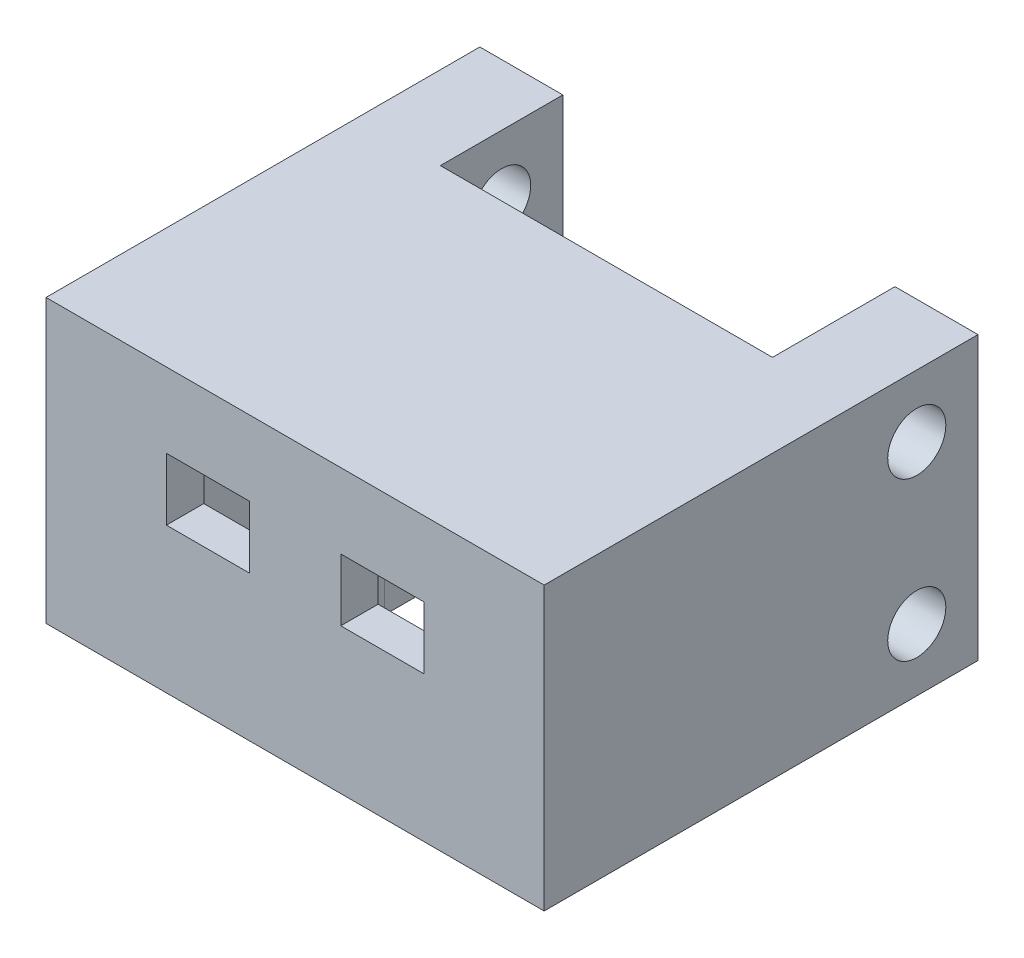
ISO-10303-21;
HEADER;
FILE_DESCRIPTION(('STEP AP214'),'2;1');
FILE_NAME('part.step','',(''),(''),'','','');
FILE_SCHEMA(('AUTOMOTIVE_DESIGN { 1 0 10303 214 1 1 1 1 }'));
ENDSEC;
DATA;
#1=APPLICATION_CONTEXT('core data for automotive mechanical design processes');
#2=APPLICATION_PROTOCOL_DEFINITION('international standard','automotive_design',2000,#1);
#3=PRODUCT_CONTEXT('',#1,'mechanical');
#4=PRODUCT('Part','Part','',(#3));
#5=PRODUCT_RELATED_PRODUCT_CATEGORY('part','',(#4));
#6=PRODUCT_DEFINITION_FORMATION('','',#4);
#7=PRODUCT_DEFINITION_CONTEXT('part definition',#1,'design');
#8=PRODUCT_DEFINITION('design','',#6,#7);
#9=PRODUCT_DEFINITION_SHAPE('','',#8);
#10=(LENGTH_UNIT() NAMED_UNIT(*) SI_UNIT(.MILLI.,.METRE.));
#11=(NAMED_UNIT(*) PLANE_ANGLE_UNIT() SI_UNIT($,.RADIAN.));
#12=(NAMED_UNIT(*) SI_UNIT($,.STERADIAN.) SOLID_ANGLE_UNIT());
#13=UNCERTAINTY_MEASURE_WITH_UNIT(LENGTH_MEASURE(1.E-05),#10,'distance_accuracy_value','');
#14=(GEOMETRIC_REPRESENTATION_CONTEXT(3) GLOBAL_UNCERTAINTY_ASSIGNED_CONTEXT((#13)) GLOBAL_UNIT_ASSIGNED_CONTEXT((#10,
#11,#12)) REPRESENTATION_CONTEXT('',''));
#15=CARTESIAN_POINT('',(0.,0.,0.));
#16=DIRECTION('',(0.,0.,1.));
#17=DIRECTION('',(1.,0.,0.));
#18=AXIS2_PLACEMENT_3D('',#15,#16,#17);
#19=CARTESIAN_POINT('',(0.,1.,0.));
#20=DIRECTION('',(0.,1.,0.));
#21=DIRECTION('',(0.,0.,1.));
#22=AXIS2_PLACEMENT_3D('',#19,#20,#21);
#23=PLANE('',#22);
#24=DIRECTION('',(1.,0.,0.));
#25=VECTOR('',#24,1.);
#26=CARTESIAN_POINT('',(0.,1.,3.35));
#27=LINE('',#26,#25);
#28=CARTESIAN_POINT('',(-3.3,1.,3.35));
#29=VERTEX_POINT('',#28);
#30=CARTESIAN_POINT('',(3.3,1.,3.35));
#31=VERTEX_POINT('',#30);
#32=EDGE_CURVE('E413',#29,#31,#27,.T.);
#33=ORIENTED_EDGE('',*,*,#32,.T.);
#34=DIRECTION('',(0.,0.,-1.));
#35=VECTOR('',#34,1.);
#36=CARTESIAN_POINT('',(3.3,1.,4.25));
#37=LINE('',#36,#35);
#38=CARTESIAN_POINT('',(3.3,1.,-3.25));
#39=VERTEX_POINT('',#38);
#40=EDGE_CURVE('E407',#31,#39,#37,.T.);
#41=ORIENTED_EDGE('',*,*,#40,.T.);
#42=DIRECTION('',(1.,0.,0.));
#43=VECTOR('',#42,1.);
#44=CARTESIAN_POINT('',(-4.,1.,-3.25));
#45=LINE('',#44,#43);
#46=CARTESIAN_POINT('',(2.1,1.,-3.25));
#47=VERTEX_POINT('',#46);
#48=EDGE_CURVE('E465',#47,#39,#45,.T.);
#49=ORIENTED_EDGE('',*,*,#48,.F.);
#50=DIRECTION('',(0.,0.,-1.));
#51=VECTOR('',#50,1.);
#52=CARTESIAN_POINT('',(2.1,1.,0.));
#53=LINE('',#52,#51);
#54=CARTESIAN_POINT('',(2.1,1.,0.));
#55=VERTEX_POINT('',#54);
#56=EDGE_CURVE('E436',#55,#47,#53,.T.);
#57=ORIENTED_EDGE('',*,*,#56,.F.);
#58=CARTESIAN_POINT('',(0.,1.,0.));
#59=DIRECTION('',(0.,1.,0.));
#60=DIRECTION('',(0.,0.,1.));
#61=AXIS2_PLACEMENT_3D('',#58,#59,#60);
#62=CIRCLE('',#61,2.1);
#63=CARTESIAN_POINT('',(-2.1,1.,0.));
#64=VERTEX_POINT('',#63);
#65=EDGE_CURVE('E456',#64,#55,#62,.T.);
#66=ORIENTED_EDGE('',*,*,#65,.F.);
#67=DIRECTION('',(0.,0.,-1.));
#68=VECTOR('',#67,1.);
#69=CARTESIAN_POINT('',(-2.1,1.,0.));
#70=LINE('',#69,#68);
#71=CARTESIAN_POINT('',(-2.1,1.,-3.25));
#72=VERTEX_POINT('',#71);
#73=EDGE_CURVE('E438',#64,#72,#70,.T.);
#74=ORIENTED_EDGE('',*,*,#73,.T.);
#75=CARTESIAN_POINT('',(-3.3,1.,-3.25));
#76=VERTEX_POINT('',#75);
#77=EDGE_CURVE('E462',#76,#72,#45,.T.);
#78=ORIENTED_EDGE('',*,*,#77,.F.);
#79=DIRECTION('',(0.,0.,1.));
#80=VECTOR('',#79,1.);
#81=CARTESIAN_POINT('',(-3.3,1.,-3.25));
#82=LINE('',#81,#80);
#83=EDGE_CURVE('E425',#76,#29,#82,.T.);
#84=ORIENTED_EDGE('',*,*,#83,.T.);
#85=EDGE_LOOP('',(#33,#41,#49,#57,#66,#74,#78,#84));
#86=FACE_BOUND('',#85,.T.);
#87=ADVANCED_FACE('F139',(#86),#23,.T.);
#88=CARTESIAN_POINT('',(0.,0.,0.));
#89=DIRECTION('',(0.,1.,0.));
#90=DIRECTION('',(0.,0.,1.));
#91=AXIS2_PLACEMENT_3D('',#88,#89,#90);
#92=PLANE('',#91);
#93=DIRECTION('',(0.,0.,-1.));
#94=VECTOR('',#93,1.);
#95=CARTESIAN_POINT('',(2.1,0.,0.));
#96=LINE('',#95,#94);
#97=CARTESIAN_POINT('',(2.1,0.,0.));
#98=VERTEX_POINT('',#97);
#99=CARTESIAN_POINT('',(2.1,0.,-3.25));
#100=VERTEX_POINT('',#99);
#101=EDGE_CURVE('E421',#98,#100,#96,.T.);
#102=ORIENTED_EDGE('',*,*,#101,.T.);
#103=DIRECTION('',(1.,0.,0.));
#104=VECTOR('',#103,1.);
#105=CARTESIAN_POINT('',(-4.,0.,-3.25));
#106=LINE('',#105,#104);
#107=CARTESIAN_POINT('',(4.,0.,-3.25));
#108=VERTEX_POINT('',#107);
#109=EDGE_CURVE('E467',#100,#108,#106,.T.);
#110=ORIENTED_EDGE('',*,*,#109,.T.);
#111=DIRECTION('',(0.,0.,1.));
#112=VECTOR('',#111,1.);
#113=CARTESIAN_POINT('',(4.,0.,-6.2));
#114=LINE('',#113,#112);
#115=CARTESIAN_POINT('',(4.,0.,-6.2));
#116=VERTEX_POINT('',#115);
#117=EDGE_CURVE('E402',#116,#108,#114,.T.);
#118=ORIENTED_EDGE('',*,*,#117,.F.);
#119=DIRECTION('',(1.,0.,0.));
#120=VECTOR('',#119,1.);
#121=CARTESIAN_POINT('',(4.,0.,-6.2));
#122=LINE('',#121,#120);
#123=CARTESIAN_POINT('',(6.,0.,-6.2));
#124=VERTEX_POINT('',#123);
#125=EDGE_CURVE('E397',#116,#124,#122,.T.);
#126=ORIENTED_EDGE('',*,*,#125,.T.);
#127=DIRECTION('',(0.,0.,1.));
#128=VECTOR('',#127,1.);
#129=CARTESIAN_POINT('',(6.,0.,-6.2));
#130=LINE('',#129,#128);
#131=CARTESIAN_POINT('',(6.,0.,4.25));
#132=VERTEX_POINT('',#131);
#133=EDGE_CURVE('E404',#124,#132,#130,.T.);
#134=ORIENTED_EDGE('',*,*,#133,.T.);
#135=DIRECTION('',(1.,0.,0.));
#136=VECTOR('',#135,1.);
#137=CARTESIAN_POINT('',(-4.,0.,4.25));
#138=LINE('',#137,#136);
#139=CARTESIAN_POINT('',(-6.,0.,4.25));
#140=VERTEX_POINT('',#139);
#141=EDGE_CURVE('E459',#140,#132,#138,.T.);
#142=ORIENTED_EDGE('',*,*,#141,.F.);
#143=DIRECTION('',(0.,0.,1.));
#144=VECTOR('',#143,1.);
#145=CARTESIAN_POINT('',(-6.,0.,-6.2));
#146=LINE('',#145,#144);
#147=CARTESIAN_POINT('',(-6.,0.,-6.2));
#148=VERTEX_POINT('',#147);
#149=EDGE_CURVE('E385',#148,#140,#146,.T.);
#150=ORIENTED_EDGE('',*,*,#149,.F.);
#151=DIRECTION('',(1.,0.,0.));
#152=VECTOR('',#151,1.);
#153=CARTESIAN_POINT('',(-4.,0.,-6.2));
#154=LINE('',#153,#152);
#155=CARTESIAN_POINT('',(-4.,0.,-6.2));
#156=VERTEX_POINT('',#155);
#157=EDGE_CURVE('E382',#148,#156,#154,.T.);
#158=ORIENTED_EDGE('',*,*,#157,.T.);
#159=DIRECTION('',(0.,0.,1.));
#160=VECTOR('',#159,1.);
#161=CARTESIAN_POINT('',(-4.,0.,-6.2));
#162=LINE('',#161,#160);
#163=CARTESIAN_POINT('',(-4.,0.,-3.25));
#164=VERTEX_POINT('',#163);
#165=EDGE_CURVE('E388',#156,#164,#162,.T.);
#166=ORIENTED_EDGE('',*,*,#165,.T.);
#167=CARTESIAN_POINT('',(-2.1,0.,-3.25));
#168=VERTEX_POINT('',#167);
#169=EDGE_CURVE('E468',#164,#168,#106,.T.);
#170=ORIENTED_EDGE('',*,*,#169,.T.);
#171=DIRECTION('',(0.,0.,-1.));
#172=VECTOR('',#171,1.);
#173=CARTESIAN_POINT('',(-2.1,0.,0.));
#174=LINE('',#173,#172);
#175=CARTESIAN_POINT('',(-2.1,0.,0.));
#176=VERTEX_POINT('',#175);
#177=EDGE_CURVE('E439',#176,#168,#174,.T.);
#178=ORIENTED_EDGE('',*,*,#177,.F.);
#179=CARTESIAN_POINT('',(0.,0.,0.));
#180=DIRECTION('',(0.,1.,0.));
#181=DIRECTION('',(0.,0.,1.));
#182=AXIS2_PLACEMENT_3D('',#179,#180,#181);
#183=CIRCLE('',#182,2.1);
#184=EDGE_CURVE('E455',#176,#98,#183,.T.);
#185=ORIENTED_EDGE('',*,*,#184,.T.);
#186=EDGE_LOOP('',(#102,#110,#118,#126,#134,#142,#150,#158,#166,#170,#178,#185));
#187=FACE_BOUND('',#186,.T.);
#188=ADVANCED_FACE('F539',(#187),#92,.F.);
#189=CARTESIAN_POINT('',(0.,1.,0.));
#190=DIRECTION('',(0.,-1.,0.));
#191=DIRECTION('',(0.,0.,-1.));
#192=AXIS2_PLACEMENT_3D('',#189,#190,#191);
#193=CYLINDRICAL_SURFACE('',#192,2.1);
#194=ORIENTED_EDGE('',*,*,#65,.T.);
#195=DIRECTION('',(0.,-1.,0.));
#196=VECTOR('',#195,1.);
#197=CARTESIAN_POINT('',(2.1,1.,0.));
#198=LINE('',#197,#196);
#199=EDGE_CURVE('E452',#55,#98,#198,.T.);
#200=ORIENTED_EDGE('',*,*,#199,.T.);
#201=ORIENTED_EDGE('',*,*,#184,.F.);
#202=DIRECTION('',(0.,-1.,0.));
#203=VECTOR('',#202,1.);
#204=CARTESIAN_POINT('',(-2.1,1.,0.));
#205=LINE('',#204,#203);
#206=EDGE_CURVE('E442',#64,#176,#205,.T.);
#207=ORIENTED_EDGE('',*,*,#206,.F.);
#208=EDGE_LOOP('',(#194,#200,#201,#207));
#209=FACE_BOUND('',#208,.T.);
#210=ADVANCED_FACE('F545',(#209),#193,.F.);
#211=CARTESIAN_POINT('',(-4.,1.,4.25));
#212=DIRECTION('',(0.,0.,-1.));
#213=DIRECTION('',(-1.,0.,0.));
#214=AXIS2_PLACEMENT_3D('',#211,#212,#213);
#215=PLANE('',#214);
#216=DIRECTION('',(1.,0.,0.));
#217=VECTOR('',#216,1.);
#218=CARTESIAN_POINT('',(-3.1,3.5,4.25));
#219=LINE('',#218,#217);
#220=CARTESIAN_POINT('',(-3.1,3.5,4.25));
#221=VERTEX_POINT('',#220);
#222=CARTESIAN_POINT('',(-1.1,3.5,4.25));
#223=VERTEX_POINT('',#222);
#224=EDGE_CURVE('E316',#221,#223,#219,.T.);
#225=ORIENTED_EDGE('',*,*,#224,.F.);
#226=DIRECTION('',(0.,-1.,0.));
#227=VECTOR('',#226,1.);
#228=CARTESIAN_POINT('',(-3.1,5.,4.25));
#229=LINE('',#228,#227);
#230=CARTESIAN_POINT('',(-3.1,5.,4.25));
#231=VERTEX_POINT('',#230);
#232=EDGE_CURVE('E154',#231,#221,#229,.T.);
#233=ORIENTED_EDGE('',*,*,#232,.F.);
#234=DIRECTION('',(-1.,0.,0.));
#235=VECTOR('',#234,1.);
#236=CARTESIAN_POINT('',(-3.1,5.,4.25));
#237=LINE('',#236,#235);
#238=CARTESIAN_POINT('',(-1.1,5.,4.25));
#239=VERTEX_POINT('',#238);
#240=EDGE_CURVE('E322',#239,#231,#237,.T.);
#241=ORIENTED_EDGE('',*,*,#240,.F.);
#242=DIRECTION('',(0.,1.,0.));
#243=VECTOR('',#242,1.);
#244=CARTESIAN_POINT('',(-1.1,5.,4.25));
#245=LINE('',#244,#243);
#246=EDGE_CURVE('E306',#223,#239,#245,.T.);
#247=ORIENTED_EDGE('',*,*,#246,.F.);
#248=EDGE_LOOP('',(#225,#233,#241,#247));
#249=FACE_BOUND('',#248,.T.);
#250=DIRECTION('',(1.,0.,0.));
#251=VECTOR('',#250,1.);
#252=CARTESIAN_POINT('',(1.1,3.5,4.25));
#253=LINE('',#252,#251);
#254=CARTESIAN_POINT('',(1.1,3.5,4.25));
#255=VERTEX_POINT('',#254);
#256=CARTESIAN_POINT('',(3.1,3.5,4.25));
#257=VERTEX_POINT('',#256);
#258=EDGE_CURVE('E333',#255,#257,#253,.T.);
#259=ORIENTED_EDGE('',*,*,#258,.F.);
#260=DIRECTION('',(0.,-1.,0.));
#261=VECTOR('',#260,1.);
#262=CARTESIAN_POINT('',(1.1,5.,4.25));
#263=LINE('',#262,#261);
#264=CARTESIAN_POINT('',(1.1,5.,4.25));
#265=VERTEX_POINT('',#264);
#266=EDGE_CURVE('E162',#265,#255,#263,.T.);
#267=ORIENTED_EDGE('',*,*,#266,.F.);
#268=DIRECTION('',(-1.,0.,0.));
#269=VECTOR('',#268,1.);
#270=CARTESIAN_POINT('',(1.1,5.,4.25));
#271=LINE('',#270,#269);
#272=CARTESIAN_POINT('',(3.1,5.,4.25));
#273=VERTEX_POINT('',#272);
#274=EDGE_CURVE('E340',#273,#265,#271,.T.);
#275=ORIENTED_EDGE('',*,*,#274,.F.);
#276=DIRECTION('',(0.,1.,0.));
#277=VECTOR('',#276,1.);
#278=CARTESIAN_POINT('',(3.1,5.,4.25));
#279=LINE('',#278,#277);
#280=EDGE_CURVE('E337',#257,#273,#279,.T.);
#281=ORIENTED_EDGE('',*,*,#280,.F.);
#282=EDGE_LOOP('',(#259,#267,#275,#281));
#283=FACE_BOUND('',#282,.T.);
#284=ORIENTED_EDGE('',*,*,#141,.T.);
#285=DIRECTION('',(0.,1.,0.));
#286=VECTOR('',#285,1.);
#287=CARTESIAN_POINT('',(6.,5.8,4.25));
#288=LINE('',#287,#286);
#289=CARTESIAN_POINT('',(6.,6.8,4.25));
#290=VERTEX_POINT('',#289);
#291=EDGE_CURVE('E391',#132,#290,#288,.T.);
#292=ORIENTED_EDGE('',*,*,#291,.T.);
#293=DIRECTION('',(1.,0.,0.));
#294=VECTOR('',#293,1.);
#295=CARTESIAN_POINT('',(0.,6.8,4.25));
#296=LINE('',#295,#294);
#297=CARTESIAN_POINT('',(-6.,6.8,4.25));
#298=VERTEX_POINT('',#297);
#299=EDGE_CURVE('E363',#298,#290,#296,.T.);
#300=ORIENTED_EDGE('',*,*,#299,.F.);
#301=DIRECTION('',(0.,-1.,0.));
#302=VECTOR('',#301,1.);
#303=CARTESIAN_POINT('',(-6.,5.8,4.25));
#304=LINE('',#303,#302);
#305=EDGE_CURVE('E375',#298,#140,#304,.T.);
#306=ORIENTED_EDGE('',*,*,#305,.T.);
#307=EDGE_LOOP('',(#284,#292,#300,#306));
#308=FACE_BOUND('',#307,.T.);
#309=ADVANCED_FACE('F141',(#249,#283,#308),#215,.F.);
#310=CARTESIAN_POINT('',(-4.,1.,-3.25));
#311=DIRECTION('',(0.,0.,-1.));
#312=DIRECTION('',(-1.,0.,0.));
#313=AXIS2_PLACEMENT_3D('',#310,#311,#312);
#314=PLANE('',#313);
#315=DIRECTION('',(0.,-1.,0.));
#316=VECTOR('',#315,1.);
#317=CARTESIAN_POINT('',(-2.1,1.,-3.25));
#318=LINE('',#317,#316);
#319=EDGE_CURVE('E447',#72,#168,#318,.T.);
#320=ORIENTED_EDGE('',*,*,#319,.T.);
#321=ORIENTED_EDGE('',*,*,#169,.F.);
#322=DIRECTION('',(0.,-1.,0.));
#323=VECTOR('',#322,1.);
#324=CARTESIAN_POINT('',(-4.,1.,-3.25));
#325=LINE('',#324,#323);
#326=CARTESIAN_POINT('',(-4.,6.8,-3.25));
#327=VERTEX_POINT('',#326);
#328=EDGE_CURVE('E464',#327,#164,#325,.T.);
#329=ORIENTED_EDGE('',*,*,#328,.F.);
#330=DIRECTION('',(1.,0.,0.));
#331=VECTOR('',#330,1.);
#332=CARTESIAN_POINT('',(0.,6.8,-3.25));
#333=LINE('',#332,#331);
#334=CARTESIAN_POINT('',(4.,6.8,-3.25));
#335=VERTEX_POINT('',#334);
#336=EDGE_CURVE('E351',#327,#335,#333,.T.);
#337=ORIENTED_EDGE('',*,*,#336,.T.);
#338=DIRECTION('',(0.,-1.,0.));
#339=VECTOR('',#338,1.);
#340=CARTESIAN_POINT('',(4.,1.,-3.25));
#341=LINE('',#340,#339);
#342=EDGE_CURVE('E473',#335,#108,#341,.T.);
#343=ORIENTED_EDGE('',*,*,#342,.T.);
#344=ORIENTED_EDGE('',*,*,#109,.F.);
#345=DIRECTION('',(0.,-1.,0.));
#346=VECTOR('',#345,1.);
#347=CARTESIAN_POINT('',(2.1,1.,-3.25));
#348=LINE('',#347,#346);
#349=EDGE_CURVE('E450',#47,#100,#348,.T.);
#350=ORIENTED_EDGE('',*,*,#349,.F.);
#351=ORIENTED_EDGE('',*,*,#48,.T.);
#352=DIRECTION('',(0.,-1.,0.));
#353=VECTOR('',#352,1.);
#354=CARTESIAN_POINT('',(3.3,5.8,-3.25));
#355=LINE('',#354,#353);
#356=CARTESIAN_POINT('',(3.3,5.8,-3.25));
#357=VERTEX_POINT('',#356);
#358=EDGE_CURVE('E428',#357,#39,#355,.T.);
#359=ORIENTED_EDGE('',*,*,#358,.F.);
#360=DIRECTION('',(1.,0.,0.));
#361=VECTOR('',#360,1.);
#362=CARTESIAN_POINT('',(0.,5.8,-3.25));
#363=LINE('',#362,#361);
#364=CARTESIAN_POINT('',(-3.3,5.8,-3.25));
#365=VERTEX_POINT('',#364);
#366=EDGE_CURVE('E329',#365,#357,#363,.T.);
#367=ORIENTED_EDGE('',*,*,#366,.F.);
#368=DIRECTION('',(0.,-1.,0.));
#369=VECTOR('',#368,1.);
#370=CARTESIAN_POINT('',(-3.3,5.8,-3.25));
#371=LINE('',#370,#369);
#372=EDGE_CURVE('E416',#365,#76,#371,.T.);
#373=ORIENTED_EDGE('',*,*,#372,.T.);
#374=ORIENTED_EDGE('',*,*,#77,.T.);
#375=EDGE_LOOP('',(#320,#321,#329,#337,#343,#344,#350,#351,#359,#367,#373,#374));
#376=FACE_BOUND('',#375,.T.);
#377=ADVANCED_FACE('F550',(#376),#314,.T.);
#378=CARTESIAN_POINT('',(-2.1,1.,0.));
#379=DIRECTION('',(-1.,0.,0.));
#380=DIRECTION('',(0.,0.,1.));
#381=AXIS2_PLACEMENT_3D('',#378,#379,#380);
#382=PLANE('',#381);
#383=ORIENTED_EDGE('',*,*,#177,.T.);
#384=ORIENTED_EDGE('',*,*,#319,.F.);
#385=ORIENTED_EDGE('',*,*,#73,.F.);
#386=ORIENTED_EDGE('',*,*,#206,.T.);
#387=EDGE_LOOP('',(#383,#384,#385,#386));
#388=FACE_BOUND('',#387,.T.);
#389=ADVANCED_FACE('F552',(#388),#382,.F.);
#390=CARTESIAN_POINT('',(2.1,1.,0.));
#391=DIRECTION('',(-1.,0.,0.));
#392=DIRECTION('',(0.,0.,1.));
#393=AXIS2_PLACEMENT_3D('',#390,#391,#392);
#394=PLANE('',#393);
#395=ORIENTED_EDGE('',*,*,#101,.F.);
#396=ORIENTED_EDGE('',*,*,#199,.F.);
#397=ORIENTED_EDGE('',*,*,#56,.T.);
#398=ORIENTED_EDGE('',*,*,#349,.T.);
#399=EDGE_LOOP('',(#395,#396,#397,#398));
#400=FACE_BOUND('',#399,.T.);
#401=ADVANCED_FACE('F558',(#400),#394,.T.);
#402=CARTESIAN_POINT('',(0.,5.8,3.35));
#403=DIRECTION('',(0.,0.,-1.));
#404=DIRECTION('',(-1.,0.,0.));
#405=AXIS2_PLACEMENT_3D('',#402,#403,#404);
#406=PLANE('',#405);
#407=DIRECTION('',(0.,1.,0.));
#408=VECTOR('',#407,1.);
#409=CARTESIAN_POINT('',(-3.1,5.8,3.35));
#410=LINE('',#409,#408);
#411=CARTESIAN_POINT('',(-3.1,3.5,3.35));
#412=VERTEX_POINT('',#411);
#413=CARTESIAN_POINT('',(-3.1,5.,3.35));
#414=VERTEX_POINT('',#413);
#415=EDGE_CURVE('E12',#412,#414,#410,.T.);
#416=ORIENTED_EDGE('',*,*,#415,.F.);
#417=DIRECTION('',(-1.,0.,0.));
#418=VECTOR('',#417,1.);
#419=CARTESIAN_POINT('',(0.,3.5,3.35));
#420=LINE('',#419,#418);
#421=CARTESIAN_POINT('',(-1.1,3.5,3.35));
#422=VERTEX_POINT('',#421);
#423=EDGE_CURVE('E485',#422,#412,#420,.T.);
#424=ORIENTED_EDGE('',*,*,#423,.F.);
#425=DIRECTION('',(0.,-1.,0.));
#426=VECTOR('',#425,1.);
#427=CARTESIAN_POINT('',(-1.1,5.8,3.35));
#428=LINE('',#427,#426);
#429=CARTESIAN_POINT('',(-1.1,5.,3.35));
#430=VERTEX_POINT('',#429);
#431=EDGE_CURVE('E309',#430,#422,#428,.T.);
#432=ORIENTED_EDGE('',*,*,#431,.F.);
#433=DIRECTION('',(1.,0.,0.));
#434=VECTOR('',#433,1.);
#435=CARTESIAN_POINT('',(0.,5.,3.35));
#436=LINE('',#435,#434);
#437=EDGE_CURVE('E147',#414,#430,#436,.T.);
#438=ORIENTED_EDGE('',*,*,#437,.F.);
#439=EDGE_LOOP('',(#416,#424,#432,#438));
#440=FACE_BOUND('',#439,.T.);
#441=DIRECTION('',(0.,1.,0.));
#442=VECTOR('',#441,1.);
#443=CARTESIAN_POINT('',(1.1,5.8,3.35));
#444=LINE('',#443,#442);
#445=CARTESIAN_POINT('',(1.1,3.5,3.35));
#446=VERTEX_POINT('',#445);
#447=CARTESIAN_POINT('',(1.1,5.,3.35));
#448=VERTEX_POINT('',#447);
#449=EDGE_CURVE('E483',#446,#448,#444,.T.);
#450=ORIENTED_EDGE('',*,*,#449,.F.);
#451=DIRECTION('',(-1.,0.,0.));
#452=VECTOR('',#451,1.);
#453=CARTESIAN_POINT('',(0.,3.5,3.35));
#454=LINE('',#453,#452);
#455=CARTESIAN_POINT('',(3.1,3.5,3.35));
#456=VERTEX_POINT('',#455);
#457=EDGE_CURVE('E476',#456,#446,#454,.T.);
#458=ORIENTED_EDGE('',*,*,#457,.F.);
#459=DIRECTION('',(0.,-1.,0.));
#460=VECTOR('',#459,1.);
#461=CARTESIAN_POINT('',(3.1,5.8,3.35));
#462=LINE('',#461,#460);
#463=CARTESIAN_POINT('',(3.1,5.,3.35));
#464=VERTEX_POINT('',#463);
#465=EDGE_CURVE('E478',#464,#456,#462,.T.);
#466=ORIENTED_EDGE('',*,*,#465,.F.);
#467=DIRECTION('',(1.,0.,0.));
#468=VECTOR('',#467,1.);
#469=CARTESIAN_POINT('',(0.,5.,3.35));
#470=LINE('',#469,#468);
#471=EDGE_CURVE('E481',#448,#464,#470,.T.);
#472=ORIENTED_EDGE('',*,*,#471,.F.);
#473=EDGE_LOOP('',(#450,#458,#466,#472));
#474=FACE_BOUND('',#473,.T.);
#475=ORIENTED_EDGE('',*,*,#32,.F.);
#476=DIRECTION('',(0.,-1.,0.));
#477=VECTOR('',#476,1.);
#478=CARTESIAN_POINT('',(-3.3,5.8,3.35));
#479=LINE('',#478,#477);
#480=CARTESIAN_POINT('',(-3.3,5.8,3.35));
#481=VERTEX_POINT('',#480);
#482=EDGE_CURVE('E418',#481,#29,#479,.T.);
#483=ORIENTED_EDGE('',*,*,#482,.F.);
#484=DIRECTION('',(1.,0.,0.));
#485=VECTOR('',#484,1.);
#486=CARTESIAN_POINT('',(0.,5.8,3.35));
#487=LINE('',#486,#485);
#488=CARTESIAN_POINT('',(3.3,5.8,3.35));
#489=VERTEX_POINT('',#488);
#490=EDGE_CURVE('E409',#481,#489,#487,.T.);
#491=ORIENTED_EDGE('',*,*,#490,.T.);
#492=DIRECTION('',(0.,-1.,0.));
#493=VECTOR('',#492,1.);
#494=CARTESIAN_POINT('',(3.3,5.8,3.35));
#495=LINE('',#494,#493);
#496=EDGE_CURVE('E412',#489,#31,#495,.T.);
#497=ORIENTED_EDGE('',*,*,#496,.T.);
#498=EDGE_LOOP('',(#475,#483,#491,#497));
#499=FACE_BOUND('',#498,.T.);
#500=ADVANCED_FACE('F493',(#440,#474,#499),#406,.T.);
#501=CARTESIAN_POINT('',(3.3,5.8,4.25));
#502=DIRECTION('',(-1.,0.,0.));
#503=DIRECTION('',(0.,0.,1.));
#504=AXIS2_PLACEMENT_3D('',#501,#502,#503);
#505=PLANE('',#504);
#506=ORIENTED_EDGE('',*,*,#496,.F.);
#507=DIRECTION('',(0.,0.,-1.));
#508=VECTOR('',#507,1.);
#509=CARTESIAN_POINT('',(3.3,5.8,4.25));
#510=LINE('',#509,#508);
#511=EDGE_CURVE('E430',#489,#357,#510,.T.);
#512=ORIENTED_EDGE('',*,*,#511,.T.);
#513=ORIENTED_EDGE('',*,*,#358,.T.);
#514=ORIENTED_EDGE('',*,*,#40,.F.);
#515=EDGE_LOOP('',(#506,#512,#513,#514));
#516=FACE_BOUND('',#515,.T.);
#517=ADVANCED_FACE('F604',(#516),#505,.T.);
#518=CARTESIAN_POINT('',(-3.3,5.8,-3.25));
#519=DIRECTION('',(1.,0.,0.));
#520=DIRECTION('',(0.,0.,-1.));
#521=AXIS2_PLACEMENT_3D('',#518,#519,#520);
#522=PLANE('',#521);
#523=DIRECTION('',(0.,0.,1.));
#524=VECTOR('',#523,1.);
#525=CARTESIAN_POINT('',(-3.3,5.8,-3.25));
#526=LINE('',#525,#524);
#527=EDGE_CURVE('E422',#365,#481,#526,.T.);
#528=ORIENTED_EDGE('',*,*,#527,.T.);
#529=ORIENTED_EDGE('',*,*,#482,.T.);
#530=ORIENTED_EDGE('',*,*,#83,.F.);
#531=ORIENTED_EDGE('',*,*,#372,.F.);
#532=EDGE_LOOP('',(#528,#529,#530,#531));
#533=FACE_BOUND('',#532,.T.);
#534=ADVANCED_FACE('F610',(#533),#522,.T.);
#535=CARTESIAN_POINT('',(4.,5.8,-6.2));
#536=DIRECTION('',(-1.,0.,0.));
#537=DIRECTION('',(0.,0.,1.));
#538=AXIS2_PLACEMENT_3D('',#535,#536,#537);
#539=PLANE('',#538);
#540=CARTESIAN_POINT('',(4.,5.3,-4.725));
#541=DIRECTION('',(-1.,0.,0.));
#542=DIRECTION('',(0.,0.,1.));
#543=AXIS2_PLACEMENT_3D('',#540,#541,#542);
#544=CIRCLE('',#543,0.700000000000001);
#545=CARTESIAN_POINT('',(4.,5.3,-4.025));
#546=VERTEX_POINT('',#545);
#547=EDGE_CURVE('E334',#546,#546,#544,.T.);
#548=ORIENTED_EDGE('',*,*,#547,.F.);
#549=EDGE_LOOP('',(#548));
#550=FACE_BOUND('',#549,.T.);
#551=CARTESIAN_POINT('',(4.,1.5,-4.725));
#552=DIRECTION('',(-1.,0.,0.));
#553=DIRECTION('',(0.,0.,1.));
#554=AXIS2_PLACEMENT_3D('',#551,#552,#553);
#555=CIRCLE('',#554,0.700000000000002);
#556=CARTESIAN_POINT('',(4.,1.5,-4.025));
#557=VERTEX_POINT('',#556);
#558=EDGE_CURVE('E502',#557,#557,#555,.T.);
#559=ORIENTED_EDGE('',*,*,#558,.F.);
#560=EDGE_LOOP('',(#559));
#561=FACE_BOUND('',#560,.T.);
#562=ORIENTED_EDGE('',*,*,#342,.F.);
#563=DIRECTION('',(0.,0.,1.));
#564=VECTOR('',#563,1.);
#565=CARTESIAN_POINT('',(4.,6.8,0.));
#566=LINE('',#565,#564);
#567=CARTESIAN_POINT('',(4.,6.8,-6.2));
#568=VERTEX_POINT('',#567);
#569=EDGE_CURVE('E372',#568,#335,#566,.T.);
#570=ORIENTED_EDGE('',*,*,#569,.F.);
#571=DIRECTION('',(0.,-1.,0.));
#572=VECTOR('',#571,1.);
#573=CARTESIAN_POINT('',(4.,5.8,-6.2));
#574=LINE('',#573,#572);
#575=EDGE_CURVE('E394',#568,#116,#574,.T.);
#576=ORIENTED_EDGE('',*,*,#575,.T.);
#577=ORIENTED_EDGE('',*,*,#117,.T.);
#578=EDGE_LOOP('',(#562,#570,#576,#577));
#579=FACE_BOUND('',#578,.T.);
#580=ADVANCED_FACE('F592',(#550,#561,#579),#539,.T.);
#581=CARTESIAN_POINT('',(6.,5.8,-6.2));
#582=DIRECTION('',(1.,0.,0.));
#583=DIRECTION('',(0.,1.,0.));
#584=AXIS2_PLACEMENT_3D('',#581,#582,#583);
#585=PLANE('',#584);
#586=CARTESIAN_POINT('',(6.,5.3,-4.725));
#587=DIRECTION('',(-1.,0.,0.));
#588=DIRECTION('',(0.,-1.,0.));
#589=AXIS2_PLACEMENT_3D('',#586,#587,#588);
#590=CIRCLE('',#589,0.700000000000001);
#591=CARTESIAN_POINT('',(6.,4.6,-4.725));
#592=VERTEX_POINT('',#591);
#593=EDGE_CURVE('E508',#592,#592,#590,.T.);
#594=ORIENTED_EDGE('',*,*,#593,.T.);
#595=EDGE_LOOP('',(#594));
#596=FACE_BOUND('',#595,.T.);
#597=CARTESIAN_POINT('',(6.00000000000001,1.5,-4.725));
#598=DIRECTION('',(-1.,0.,0.));
#599=DIRECTION('',(0.,-1.,0.));
#600=AXIS2_PLACEMENT_3D('',#597,#598,#599);
#601=CIRCLE('',#600,0.700000000000002);
#602=CARTESIAN_POINT('',(6.00000000000001,0.8,-4.725));
#603=VERTEX_POINT('',#602);
#604=EDGE_CURVE('E509',#603,#603,#601,.T.);
#605=ORIENTED_EDGE('',*,*,#604,.T.);
#606=EDGE_LOOP('',(#605));
#607=FACE_BOUND('',#606,.T.);
#608=ORIENTED_EDGE('',*,*,#291,.F.);
#609=ORIENTED_EDGE('',*,*,#133,.F.);
#610=DIRECTION('',(0.,1.,0.));
#611=VECTOR('',#610,1.);
#612=CARTESIAN_POINT('',(6.,5.8,-6.2));
#613=LINE('',#612,#611);
#614=CARTESIAN_POINT('',(6.,6.8,-6.2));
#615=VERTEX_POINT('',#614);
#616=EDGE_CURVE('E400',#124,#615,#613,.T.);
#617=ORIENTED_EDGE('',*,*,#616,.T.);
#618=DIRECTION('',(0.,0.,-1.));
#619=VECTOR('',#618,1.);
#620=CARTESIAN_POINT('',(6.,6.8,0.));
#621=LINE('',#620,#619);
#622=EDGE_CURVE('E366',#290,#615,#621,.T.);
#623=ORIENTED_EDGE('',*,*,#622,.F.);
#624=EDGE_LOOP('',(#608,#609,#617,#623));
#625=FACE_BOUND('',#624,.T.);
#626=ADVANCED_FACE('F521',(#596,#607,#625),#585,.T.);
#627=CARTESIAN_POINT('',(0.,0.,-6.2));
#628=DIRECTION('',(0.,0.,1.));
#629=DIRECTION('',(1.,0.,0.));
#630=AXIS2_PLACEMENT_3D('',#627,#628,#629);
#631=PLANE('',#630);
#632=ORIENTED_EDGE('',*,*,#575,.F.);
#633=DIRECTION('',(-1.,0.,0.));
#634=VECTOR('',#633,1.);
#635=CARTESIAN_POINT('',(0.,6.8,-6.2));
#636=LINE('',#635,#634);
#637=EDGE_CURVE('E369',#615,#568,#636,.T.);
#638=ORIENTED_EDGE('',*,*,#637,.F.);
#639=ORIENTED_EDGE('',*,*,#616,.F.);
#640=ORIENTED_EDGE('',*,*,#125,.F.);
#641=EDGE_LOOP('',(#632,#638,#639,#640));
#642=FACE_BOUND('',#641,.T.);
#643=ADVANCED_FACE('F588',(#642),#631,.F.);
#644=CARTESIAN_POINT('',(-4.,5.8,-6.2));
#645=DIRECTION('',(1.,0.,0.));
#646=DIRECTION('',(0.,1.,0.));
#647=AXIS2_PLACEMENT_3D('',#644,#645,#646);
#648=PLANE('',#647);
#649=CARTESIAN_POINT('',(-4.,5.3,-4.725));
#650=DIRECTION('',(1.,0.,0.));
#651=DIRECTION('',(0.,1.,0.));
#652=AXIS2_PLACEMENT_3D('',#649,#650,#651);
#653=CIRCLE('',#652,0.700000000000001);
#654=CARTESIAN_POINT('',(-4.,6.,-4.725));
#655=VERTEX_POINT('',#654);
#656=EDGE_CURVE('E499',#655,#655,#653,.T.);
#657=ORIENTED_EDGE('',*,*,#656,.F.);
#658=EDGE_LOOP('',(#657));
#659=FACE_BOUND('',#658,.T.);
#660=CARTESIAN_POINT('',(-4.,1.5,-4.725));
#661=DIRECTION('',(1.,0.,0.));
#662=DIRECTION('',(0.,1.,0.));
#663=AXIS2_PLACEMENT_3D('',#660,#661,#662);
#664=CIRCLE('',#663,0.700000000000002);
#665=CARTESIAN_POINT('',(-4.,2.2,-4.725));
#666=VERTEX_POINT('',#665);
#667=EDGE_CURVE('E505',#666,#666,#664,.T.);
#668=ORIENTED_EDGE('',*,*,#667,.F.);
#669=EDGE_LOOP('',(#668));
#670=FACE_BOUND('',#669,.T.);
#671=DIRECTION('',(0.,1.,0.));
#672=VECTOR('',#671,1.);
#673=CARTESIAN_POINT('',(-4.,5.8,-6.2));
#674=LINE('',#673,#672);
#675=CARTESIAN_POINT('',(-4.,6.8,-6.2));
#676=VERTEX_POINT('',#675);
#677=EDGE_CURVE('E377',#156,#676,#674,.T.);
#678=ORIENTED_EDGE('',*,*,#677,.T.);
#679=DIRECTION('',(0.,0.,-1.));
#680=VECTOR('',#679,1.);
#681=CARTESIAN_POINT('',(-4.,6.8,0.));
#682=LINE('',#681,#680);
#683=EDGE_CURVE('E354',#327,#676,#682,.T.);
#684=ORIENTED_EDGE('',*,*,#683,.F.);
#685=ORIENTED_EDGE('',*,*,#328,.T.);
#686=ORIENTED_EDGE('',*,*,#165,.F.);
#687=EDGE_LOOP('',(#678,#684,#685,#686));
#688=FACE_BOUND('',#687,.T.);
#689=ADVANCED_FACE('F568',(#659,#670,#688),#648,.T.);
#690=CARTESIAN_POINT('',(-6.,5.8,-6.2));
#691=DIRECTION('',(-1.,0.,0.));
#692=DIRECTION('',(0.,-1.,0.));
#693=AXIS2_PLACEMENT_3D('',#690,#691,#692);
#694=PLANE('',#693);
#695=CARTESIAN_POINT('',(-6.,5.3,-4.725));
#696=DIRECTION('',(-1.,0.,0.));
#697=DIRECTION('',(0.,-1.,0.));
#698=AXIS2_PLACEMENT_3D('',#695,#696,#697);
#699=CIRCLE('',#698,0.700000000000001);
#700=CARTESIAN_POINT('',(-6.,4.6,-4.725));
#701=VERTEX_POINT('',#700);
#702=EDGE_CURVE('E515',#701,#701,#699,.T.);
#703=ORIENTED_EDGE('',*,*,#702,.F.);
#704=EDGE_LOOP('',(#703));
#705=FACE_BOUND('',#704,.T.);
#706=CARTESIAN_POINT('',(-6.,1.5,-4.725));
#707=DIRECTION('',(-1.,0.,0.));
#708=DIRECTION('',(0.,-1.,0.));
#709=AXIS2_PLACEMENT_3D('',#706,#707,#708);
#710=CIRCLE('',#709,0.700000000000002);
#711=CARTESIAN_POINT('',(-6.,0.799999999999998,-4.725));
#712=VERTEX_POINT('',#711);
#713=EDGE_CURVE('E512',#712,#712,#710,.T.);
#714=ORIENTED_EDGE('',*,*,#713,.F.);
#715=EDGE_LOOP('',(#714));
#716=FACE_BOUND('',#715,.T.);
#717=ORIENTED_EDGE('',*,*,#305,.F.);
#718=DIRECTION('',(0.,0.,1.));
#719=VECTOR('',#718,1.);
#720=CARTESIAN_POINT('',(-6.,6.8,0.));
#721=LINE('',#720,#719);
#722=CARTESIAN_POINT('',(-6.,6.8,-6.2));
#723=VERTEX_POINT('',#722);
#724=EDGE_CURVE('E360',#723,#298,#721,.T.);
#725=ORIENTED_EDGE('',*,*,#724,.F.);
#726=DIRECTION('',(0.,-1.,0.));
#727=VECTOR('',#726,1.);
#728=CARTESIAN_POINT('',(-6.,5.8,-6.2));
#729=LINE('',#728,#727);
#730=EDGE_CURVE('E379',#723,#148,#729,.T.);
#731=ORIENTED_EDGE('',*,*,#730,.T.);
#732=ORIENTED_EDGE('',*,*,#149,.T.);
#733=EDGE_LOOP('',(#717,#725,#731,#732));
#734=FACE_BOUND('',#733,.T.);
#735=ADVANCED_FACE('F579',(#705,#716,#734),#694,.T.);
#736=CARTESIAN_POINT('',(0.,0.,-6.2));
#737=DIRECTION('',(0.,0.,-1.));
#738=DIRECTION('',(-1.,0.,0.));
#739=AXIS2_PLACEMENT_3D('',#736,#737,#738);
#740=PLANE('',#739);
#741=ORIENTED_EDGE('',*,*,#677,.F.);
#742=ORIENTED_EDGE('',*,*,#157,.F.);
#743=ORIENTED_EDGE('',*,*,#730,.F.);
#744=DIRECTION('',(-1.,0.,0.));
#745=VECTOR('',#744,1.);
#746=CARTESIAN_POINT('',(0.,6.8,-6.2));
#747=LINE('',#746,#745);
#748=EDGE_CURVE('E357',#676,#723,#747,.T.);
#749=ORIENTED_EDGE('',*,*,#748,.F.);
#750=EDGE_LOOP('',(#741,#742,#743,#749));
#751=FACE_BOUND('',#750,.T.);
#752=ADVANCED_FACE('F572',(#751),#740,.T.);
#753=CARTESIAN_POINT('',(0.,6.8,0.));
#754=DIRECTION('',(0.,1.,0.));
#755=DIRECTION('',(0.,0.,1.));
#756=AXIS2_PLACEMENT_3D('',#753,#754,#755);
#757=PLANE('',#756);
#758=ORIENTED_EDGE('',*,*,#336,.F.);
#759=ORIENTED_EDGE('',*,*,#683,.T.);
#760=ORIENTED_EDGE('',*,*,#748,.T.);
#761=ORIENTED_EDGE('',*,*,#724,.T.);
#762=ORIENTED_EDGE('',*,*,#299,.T.);
#763=ORIENTED_EDGE('',*,*,#622,.T.);
#764=ORIENTED_EDGE('',*,*,#637,.T.);
#765=ORIENTED_EDGE('',*,*,#569,.T.);
#766=EDGE_LOOP('',(#758,#759,#760,#761,#762,#763,#764,#765));
#767=FACE_BOUND('',#766,.T.);
#768=ADVANCED_FACE('F576',(#767),#757,.T.);
#769=CARTESIAN_POINT('',(0.,5.8,0.));
#770=DIRECTION('',(0.,1.,0.));
#771=DIRECTION('',(0.,0.,1.));
#772=AXIS2_PLACEMENT_3D('',#769,#770,#771);
#773=PLANE('',#772);
#774=ORIENTED_EDGE('',*,*,#527,.F.);
#775=ORIENTED_EDGE('',*,*,#366,.T.);
#776=ORIENTED_EDGE('',*,*,#511,.F.);
#777=ORIENTED_EDGE('',*,*,#490,.F.);
#778=EDGE_LOOP('',(#774,#775,#776,#777));
#779=FACE_BOUND('',#778,.T.);
#780=ADVANCED_FACE('F639',(#779),#773,.F.);
#781=CARTESIAN_POINT('',(1.1,5.,-6.2));
#782=DIRECTION('',(-1.,0.,0.));
#783=DIRECTION('',(0.,0.,1.));
#784=AXIS2_PLACEMENT_3D('',#781,#782,#783);
#785=PLANE('',#784);
#786=ORIENTED_EDGE('',*,*,#449,.T.);
#787=DIRECTION('',(0.,0.,1.));
#788=VECTOR('',#787,1.);
#789=CARTESIAN_POINT('',(1.1,5.,-6.2));
#790=LINE('',#789,#788);
#791=EDGE_CURVE('E344',#448,#265,#790,.T.);
#792=ORIENTED_EDGE('',*,*,#791,.T.);
#793=ORIENTED_EDGE('',*,*,#266,.T.);
#794=DIRECTION('',(0.,0.,1.));
#795=VECTOR('',#794,1.);
#796=CARTESIAN_POINT('',(1.1,3.5,-6.2));
#797=LINE('',#796,#795);
#798=EDGE_CURVE('E343',#446,#255,#797,.T.);
#799=ORIENTED_EDGE('',*,*,#798,.F.);
#800=EDGE_LOOP('',(#786,#792,#793,#799));
#801=FACE_BOUND('',#800,.T.);
#802=ADVANCED_FACE('F642',(#801),#785,.F.);
#803=CARTESIAN_POINT('',(1.1,5.,-6.2));
#804=DIRECTION('',(0.,1.,0.));
#805=DIRECTION('',(0.,0.,1.));
#806=AXIS2_PLACEMENT_3D('',#803,#804,#805);
#807=PLANE('',#806);
#808=ORIENTED_EDGE('',*,*,#471,.T.);
#809=DIRECTION('',(0.,0.,1.));
#810=VECTOR('',#809,1.);
#811=CARTESIAN_POINT('',(3.1,5.,-6.2));
#812=LINE('',#811,#810);
#813=EDGE_CURVE('E346',#464,#273,#812,.T.);
#814=ORIENTED_EDGE('',*,*,#813,.T.);
#815=ORIENTED_EDGE('',*,*,#274,.T.);
#816=ORIENTED_EDGE('',*,*,#791,.F.);
#817=EDGE_LOOP('',(#808,#814,#815,#816));
#818=FACE_BOUND('',#817,.T.);
#819=ADVANCED_FACE('F647',(#818),#807,.F.);
#820=CARTESIAN_POINT('',(3.1,5.,-6.2));
#821=DIRECTION('',(1.,0.,0.));
#822=DIRECTION('',(0.,0.,-1.));
#823=AXIS2_PLACEMENT_3D('',#820,#821,#822);
#824=PLANE('',#823);
#825=ORIENTED_EDGE('',*,*,#465,.T.);
#826=DIRECTION('',(0.,0.,1.));
#827=VECTOR('',#826,1.);
#828=CARTESIAN_POINT('',(3.1,3.5,-6.2));
#829=LINE('',#828,#827);
#830=EDGE_CURVE('E348',#456,#257,#829,.T.);
#831=ORIENTED_EDGE('',*,*,#830,.T.);
#832=ORIENTED_EDGE('',*,*,#280,.T.);
#833=ORIENTED_EDGE('',*,*,#813,.F.);
#834=EDGE_LOOP('',(#825,#831,#832,#833));
#835=FACE_BOUND('',#834,.T.);
#836=ADVANCED_FACE('F651',(#835),#824,.F.);
#837=CARTESIAN_POINT('',(1.1,3.5,-6.2));
#838=DIRECTION('',(0.,-1.,0.));
#839=DIRECTION('',(0.,0.,-1.));
#840=AXIS2_PLACEMENT_3D('',#837,#838,#839);
#841=PLANE('',#840);
#842=ORIENTED_EDGE('',*,*,#457,.T.);
#843=ORIENTED_EDGE('',*,*,#798,.T.);
#844=ORIENTED_EDGE('',*,*,#258,.T.);
#845=ORIENTED_EDGE('',*,*,#830,.F.);
#846=EDGE_LOOP('',(#842,#843,#844,#845));
#847=FACE_BOUND('',#846,.T.);
#848=ADVANCED_FACE('F648',(#847),#841,.F.);
#849=CARTESIAN_POINT('',(-3.1,5.,-6.2));
#850=DIRECTION('',(-1.,0.,0.));
#851=DIRECTION('',(0.,0.,1.));
#852=AXIS2_PLACEMENT_3D('',#849,#850,#851);
#853=PLANE('',#852);
#854=ORIENTED_EDGE('',*,*,#415,.T.);
#855=DIRECTION('',(0.,0.,1.));
#856=VECTOR('',#855,1.);
#857=CARTESIAN_POINT('',(-3.1,5.,-6.2));
#858=LINE('',#857,#856);
#859=EDGE_CURVE('E327',#414,#231,#858,.T.);
#860=ORIENTED_EDGE('',*,*,#859,.T.);
#861=ORIENTED_EDGE('',*,*,#232,.T.);
#862=DIRECTION('',(0.,0.,1.));
#863=VECTOR('',#862,1.);
#864=CARTESIAN_POINT('',(-3.1,3.5,-6.2));
#865=LINE('',#864,#863);
#866=EDGE_CURVE('E313',#412,#221,#865,.T.);
#867=ORIENTED_EDGE('',*,*,#866,.F.);
#868=EDGE_LOOP('',(#854,#860,#861,#867));
#869=FACE_BOUND('',#868,.T.);
#870=ADVANCED_FACE('F495',(#869),#853,.F.);
#871=CARTESIAN_POINT('',(-3.1,5.,-6.2));
#872=DIRECTION('',(0.,1.,0.));
#873=DIRECTION('',(0.,0.,1.));
#874=AXIS2_PLACEMENT_3D('',#871,#872,#873);
#875=PLANE('',#874);
#876=ORIENTED_EDGE('',*,*,#437,.T.);
#877=DIRECTION('',(0.,0.,1.));
#878=VECTOR('',#877,1.);
#879=CARTESIAN_POINT('',(-1.1,5.,-6.2));
#880=LINE('',#879,#878);
#881=EDGE_CURVE('E312',#430,#239,#880,.T.);
#882=ORIENTED_EDGE('',*,*,#881,.T.);
#883=ORIENTED_EDGE('',*,*,#240,.T.);
#884=ORIENTED_EDGE('',*,*,#859,.F.);
#885=EDGE_LOOP('',(#876,#882,#883,#884));
#886=FACE_BOUND('',#885,.T.);
#887=ADVANCED_FACE('F490',(#886),#875,.F.);
#888=CARTESIAN_POINT('',(-1.1,5.,-6.2));
#889=DIRECTION('',(1.,0.,0.));
#890=DIRECTION('',(0.,1.,0.));
#891=AXIS2_PLACEMENT_3D('',#888,#889,#890);
#892=PLANE('',#891);
#893=ORIENTED_EDGE('',*,*,#431,.T.);
#894=DIRECTION('',(0.,0.,1.));
#895=VECTOR('',#894,1.);
#896=CARTESIAN_POINT('',(-1.1,3.5,-6.2));
#897=LINE('',#896,#895);
#898=EDGE_CURVE('E301',#422,#223,#897,.T.);
#899=ORIENTED_EDGE('',*,*,#898,.T.);
#900=ORIENTED_EDGE('',*,*,#246,.T.);
#901=ORIENTED_EDGE('',*,*,#881,.F.);
#902=EDGE_LOOP('',(#893,#899,#900,#901));
#903=FACE_BOUND('',#902,.T.);
#904=ADVANCED_FACE('F303',(#903),#892,.F.);
#905=CARTESIAN_POINT('',(-3.1,3.5,-6.2));
#906=DIRECTION('',(0.,-1.,0.));
#907=DIRECTION('',(1.,0.,0.));
#908=AXIS2_PLACEMENT_3D('',#905,#906,#907);
#909=PLANE('',#908);
#910=ORIENTED_EDGE('',*,*,#423,.T.);
#911=ORIENTED_EDGE('',*,*,#866,.T.);
#912=ORIENTED_EDGE('',*,*,#224,.T.);
#913=ORIENTED_EDGE('',*,*,#898,.F.);
#914=EDGE_LOOP('',(#910,#911,#912,#913));
#915=FACE_BOUND('',#914,.T.);
#916=ADVANCED_FACE('F317',(#915),#909,.F.);
#917=CARTESIAN_POINT('',(6.00000000000001,1.5,-4.725));
#918=DIRECTION('',(-1.,0.,0.));
#919=DIRECTION('',(0.,-1.,0.));
#920=AXIS2_PLACEMENT_3D('',#917,#918,#919);
#921=CYLINDRICAL_SURFACE('',#920,0.700000000000002);
#922=ORIENTED_EDGE('',*,*,#667,.T.);
#923=EDGE_LOOP('',(#922));
#924=FACE_BOUND('',#923,.T.);
#925=ORIENTED_EDGE('',*,*,#713,.T.);
#926=EDGE_LOOP('',(#925));
#927=FACE_BOUND('',#926,.T.);
#928=ADVANCED_FACE('F535',(#924,#927),#921,.F.);
#929=CARTESIAN_POINT('',(6.,5.3,-4.725));
#930=DIRECTION('',(-1.,0.,0.));
#931=DIRECTION('',(0.,-1.,0.));
#932=AXIS2_PLACEMENT_3D('',#929,#930,#931);
#933=CYLINDRICAL_SURFACE('',#932,0.700000000000001);
#934=ORIENTED_EDGE('',*,*,#656,.T.);
#935=EDGE_LOOP('',(#934));
#936=FACE_BOUND('',#935,.T.);
#937=ORIENTED_EDGE('',*,*,#702,.T.);
#938=EDGE_LOOP('',(#937));
#939=FACE_BOUND('',#938,.T.);
#940=ADVANCED_FACE('F529',(#936,#939),#933,.F.);
#941=ORIENTED_EDGE('',*,*,#558,.T.);
#942=EDGE_LOOP('',(#941));
#943=FACE_BOUND('',#942,.T.);
#944=ORIENTED_EDGE('',*,*,#604,.F.);
#945=EDGE_LOOP('',(#944));
#946=FACE_BOUND('',#945,.T.);
#947=ADVANCED_FACE('F526',(#943,#946),#921,.F.);
#948=ORIENTED_EDGE('',*,*,#547,.T.);
#949=EDGE_LOOP('',(#948));
#950=FACE_BOUND('',#949,.T.);
#951=ORIENTED_EDGE('',*,*,#593,.F.);
#952=EDGE_LOOP('',(#951));
#953=FACE_BOUND('',#952,.T.);
#954=ADVANCED_FACE('F524',(#950,#953),#933,.F.);
#955=CLOSED_SHELL('',(#87,#188,#210,#309,#377,#389,#401,#500,#517,#534,#580,#626,#643,#689,#735,
#752,#768,#780,#802,#819,#836,#848,#870,#887,#904,#916,#928,#940,#947,#954));
#956=MANIFOLD_SOLID_BREP('B2',#955);
#957=ADVANCED_BREP_SHAPE_REPRESENTATION('',(#18,#956),#14);
#958=SHAPE_DEFINITION_REPRESENTATION(#9,#957);
ENDSEC;
END-ISO-10303-21;
